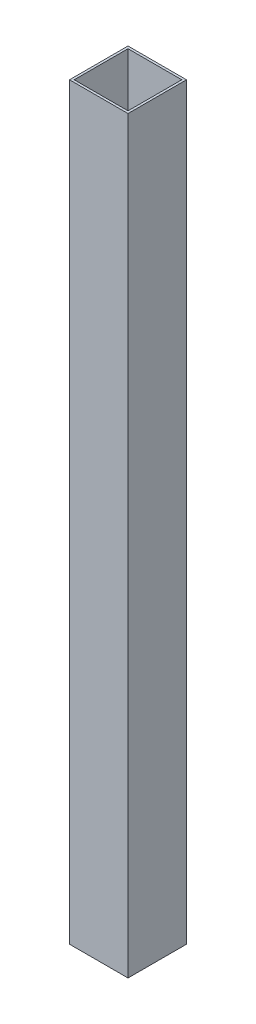
ISO-10303-21;
HEADER;
FILE_DESCRIPTION(('STEP AP214'),'2;1');
FILE_NAME('part.step','',(''),(''),'','','');
FILE_SCHEMA(('AUTOMOTIVE_DESIGN { 1 0 10303 214 1 1 1 1 }'));
ENDSEC;
DATA;
#1=APPLICATION_CONTEXT('core data for automotive mechanical design processes');
#2=APPLICATION_PROTOCOL_DEFINITION('international standard','automotive_design',2000,#1);
#3=PRODUCT_CONTEXT('',#1,'mechanical');
#4=PRODUCT('Part','Part','',(#3));
#5=PRODUCT_RELATED_PRODUCT_CATEGORY('part','',(#4));
#6=PRODUCT_DEFINITION_FORMATION('','',#4);
#7=PRODUCT_DEFINITION_CONTEXT('part definition',#1,'design');
#8=PRODUCT_DEFINITION('design','',#6,#7);
#9=PRODUCT_DEFINITION_SHAPE('','',#8);
#10=(LENGTH_UNIT() NAMED_UNIT(*) SI_UNIT(.MILLI.,.METRE.));
#11=(NAMED_UNIT(*) PLANE_ANGLE_UNIT() SI_UNIT($,.RADIAN.));
#12=(NAMED_UNIT(*) SI_UNIT($,.STERADIAN.) SOLID_ANGLE_UNIT());
#13=UNCERTAINTY_MEASURE_WITH_UNIT(LENGTH_MEASURE(1.E-05),#10,'distance_accuracy_value','');
#14=(GEOMETRIC_REPRESENTATION_CONTEXT(3) GLOBAL_UNCERTAINTY_ASSIGNED_CONTEXT((#13)) GLOBAL_UNIT_ASSIGNED_CONTEXT((#10,
#11,#12)) REPRESENTATION_CONTEXT('',''));
#15=CARTESIAN_POINT('',(0.,0.,0.));
#16=DIRECTION('',(0.,0.,1.));
#17=DIRECTION('',(1.,0.,0.));
#18=AXIS2_PLACEMENT_3D('',#15,#16,#17);
#19=CARTESIAN_POINT('',(0.,640.,0.));
#20=DIRECTION('',(0.,-1.,0.));
#21=DIRECTION('',(0.,0.,-1.));
#22=AXIS2_PLACEMENT_3D('',#19,#20,#21);
#23=PLANE('',#22);
#24=DIRECTION('',(0.,0.,-1.));
#25=VECTOR('',#24,1.);
#26=CARTESIAN_POINT('',(25.,640.,25.));
#27=LINE('',#26,#25);
#28=CARTESIAN_POINT('',(25.,640.,25.));
#29=VERTEX_POINT('',#28);
#30=CARTESIAN_POINT('',(25.,640.,-25.));
#31=VERTEX_POINT('',#30);
#32=EDGE_CURVE('E153',#29,#31,#27,.T.);
#33=ORIENTED_EDGE('',*,*,#32,.T.);
#34=DIRECTION('',(-1.,0.,0.));
#35=VECTOR('',#34,1.);
#36=CARTESIAN_POINT('',(-25.,640.,-25.));
#37=LINE('',#36,#35);
#38=CARTESIAN_POINT('',(-25.,640.,-25.));
#39=VERTEX_POINT('',#38);
#40=EDGE_CURVE('E157',#31,#39,#37,.T.);
#41=ORIENTED_EDGE('',*,*,#40,.T.);
#42=DIRECTION('',(0.,0.,1.));
#43=VECTOR('',#42,1.);
#44=CARTESIAN_POINT('',(-25.,640.,25.));
#45=LINE('',#44,#43);
#46=CARTESIAN_POINT('',(-25.,640.,25.));
#47=VERTEX_POINT('',#46);
#48=EDGE_CURVE('E161',#39,#47,#45,.T.);
#49=ORIENTED_EDGE('',*,*,#48,.T.);
#50=DIRECTION('',(1.,0.,0.));
#51=VECTOR('',#50,1.);
#52=CARTESIAN_POINT('',(-25.,640.,25.));
#53=LINE('',#52,#51);
#54=EDGE_CURVE('E164',#47,#29,#53,.T.);
#55=ORIENTED_EDGE('',*,*,#54,.T.);
#56=EDGE_LOOP('',(#33,#41,#49,#55));
#57=FACE_BOUND('',#56,.T.);
#58=DIRECTION('',(0.,0.,1.));
#59=VECTOR('',#58,1.);
#60=CARTESIAN_POINT('',(-23.,640.,23.));
#61=LINE('',#60,#59);
#62=CARTESIAN_POINT('',(-23.,640.,-23.));
#63=VERTEX_POINT('',#62);
#64=CARTESIAN_POINT('',(-23.,640.,23.));
#65=VERTEX_POINT('',#64);
#66=EDGE_CURVE('E105',#63,#65,#61,.T.);
#67=ORIENTED_EDGE('',*,*,#66,.F.);
#68=DIRECTION('',(-1.,0.,0.));
#69=VECTOR('',#68,1.);
#70=CARTESIAN_POINT('',(-23.,640.,-23.));
#71=LINE('',#70,#69);
#72=CARTESIAN_POINT('',(23.,640.,-23.));
#73=VERTEX_POINT('',#72);
#74=EDGE_CURVE('E131',#73,#63,#71,.T.);
#75=ORIENTED_EDGE('',*,*,#74,.F.);
#76=DIRECTION('',(0.,0.,-1.));
#77=VECTOR('',#76,1.);
#78=CARTESIAN_POINT('',(23.,640.,23.));
#79=LINE('',#78,#77);
#80=CARTESIAN_POINT('',(23.,640.,23.));
#81=VERTEX_POINT('',#80);
#82=EDGE_CURVE('E127',#81,#73,#79,.T.);
#83=ORIENTED_EDGE('',*,*,#82,.F.);
#84=DIRECTION('',(1.,0.,0.));
#85=VECTOR('',#84,1.);
#86=CARTESIAN_POINT('',(-23.,640.,23.));
#87=LINE('',#86,#85);
#88=EDGE_CURVE('E114',#65,#81,#87,.T.);
#89=ORIENTED_EDGE('',*,*,#88,.F.);
#90=EDGE_LOOP('',(#67,#75,#83,#89));
#91=FACE_BOUND('',#90,.T.);
#92=ADVANCED_FACE('F39',(#57,#91),#23,.F.);
#93=CARTESIAN_POINT('',(0.,0.,0.));
#94=DIRECTION('',(0.,-1.,0.));
#95=DIRECTION('',(0.,0.,-1.));
#96=AXIS2_PLACEMENT_3D('',#93,#94,#95);
#97=PLANE('',#96);
#98=DIRECTION('',(0.,0.,-1.));
#99=VECTOR('',#98,1.);
#100=CARTESIAN_POINT('',(25.,0.,25.));
#101=LINE('',#100,#99);
#102=CARTESIAN_POINT('',(25.,0.,25.));
#103=VERTEX_POINT('',#102);
#104=CARTESIAN_POINT('',(25.,0.,-25.));
#105=VERTEX_POINT('',#104);
#106=EDGE_CURVE('E123',#103,#105,#101,.T.);
#107=ORIENTED_EDGE('',*,*,#106,.F.);
#108=DIRECTION('',(1.,0.,0.));
#109=VECTOR('',#108,1.);
#110=CARTESIAN_POINT('',(-25.,0.,25.));
#111=LINE('',#110,#109);
#112=CARTESIAN_POINT('',(-25.,0.,25.));
#113=VERTEX_POINT('',#112);
#114=EDGE_CURVE('E158',#113,#103,#111,.T.);
#115=ORIENTED_EDGE('',*,*,#114,.F.);
#116=DIRECTION('',(0.,0.,1.));
#117=VECTOR('',#116,1.);
#118=CARTESIAN_POINT('',(-25.,0.,25.));
#119=LINE('',#118,#117);
#120=CARTESIAN_POINT('',(-25.,0.,-25.));
#121=VERTEX_POINT('',#120);
#122=EDGE_CURVE('E174',#121,#113,#119,.T.);
#123=ORIENTED_EDGE('',*,*,#122,.F.);
#124=DIRECTION('',(-1.,0.,0.));
#125=VECTOR('',#124,1.);
#126=CARTESIAN_POINT('',(-25.,0.,-25.));
#127=LINE('',#126,#125);
#128=EDGE_CURVE('E171',#105,#121,#127,.T.);
#129=ORIENTED_EDGE('',*,*,#128,.F.);
#130=EDGE_LOOP('',(#107,#115,#123,#129));
#131=FACE_BOUND('',#130,.T.);
#132=DIRECTION('',(-1.,0.,0.));
#133=VECTOR('',#132,1.);
#134=CARTESIAN_POINT('',(-23.,0.,-23.));
#135=LINE('',#134,#133);
#136=CARTESIAN_POINT('',(23.,0.,-23.));
#137=VERTEX_POINT('',#136);
#138=CARTESIAN_POINT('',(-23.,0.,-23.));
#139=VERTEX_POINT('',#138);
#140=EDGE_CURVE('E115',#137,#139,#135,.T.);
#141=ORIENTED_EDGE('',*,*,#140,.T.);
#142=DIRECTION('',(0.,0.,1.));
#143=VECTOR('',#142,1.);
#144=CARTESIAN_POINT('',(-23.,0.,23.));
#145=LINE('',#144,#143);
#146=CARTESIAN_POINT('',(-23.,0.,23.));
#147=VERTEX_POINT('',#146);
#148=EDGE_CURVE('E63',#139,#147,#145,.T.);
#149=ORIENTED_EDGE('',*,*,#148,.T.);
#150=DIRECTION('',(1.,0.,0.));
#151=VECTOR('',#150,1.);
#152=CARTESIAN_POINT('',(-23.,0.,23.));
#153=LINE('',#152,#151);
#154=CARTESIAN_POINT('',(23.,0.,23.));
#155=VERTEX_POINT('',#154);
#156=EDGE_CURVE('E121',#147,#155,#153,.T.);
#157=ORIENTED_EDGE('',*,*,#156,.T.);
#158=DIRECTION('',(0.,0.,-1.));
#159=VECTOR('',#158,1.);
#160=CARTESIAN_POINT('',(23.,0.,23.));
#161=LINE('',#160,#159);
#162=EDGE_CURVE('E140',#155,#137,#161,.T.);
#163=ORIENTED_EDGE('',*,*,#162,.T.);
#164=EDGE_LOOP('',(#141,#149,#157,#163));
#165=FACE_BOUND('',#164,.T.);
#166=ADVANCED_FACE('F197',(#131,#165),#97,.T.);
#167=CARTESIAN_POINT('',(25.,640.,25.));
#168=DIRECTION('',(-1.,0.,0.));
#169=DIRECTION('',(0.,0.,1.));
#170=AXIS2_PLACEMENT_3D('',#167,#168,#169);
#171=PLANE('',#170);
#172=ORIENTED_EDGE('',*,*,#106,.T.);
#173=DIRECTION('',(0.,-1.,0.));
#174=VECTOR('',#173,1.);
#175=CARTESIAN_POINT('',(25.,640.,-25.));
#176=LINE('',#175,#174);
#177=EDGE_CURVE('E11',#31,#105,#176,.T.);
#178=ORIENTED_EDGE('',*,*,#177,.F.);
#179=ORIENTED_EDGE('',*,*,#32,.F.);
#180=DIRECTION('',(0.,-1.,0.));
#181=VECTOR('',#180,1.);
#182=CARTESIAN_POINT('',(25.,640.,25.));
#183=LINE('',#182,#181);
#184=EDGE_CURVE('E167',#29,#103,#183,.T.);
#185=ORIENTED_EDGE('',*,*,#184,.T.);
#186=EDGE_LOOP('',(#172,#178,#179,#185));
#187=FACE_BOUND('',#186,.T.);
#188=ADVANCED_FACE('F41',(#187),#171,.F.);
#189=CARTESIAN_POINT('',(-25.,640.,-25.));
#190=DIRECTION('',(0.,0.,1.));
#191=DIRECTION('',(1.,0.,0.));
#192=AXIS2_PLACEMENT_3D('',#189,#190,#191);
#193=PLANE('',#192);
#194=ORIENTED_EDGE('',*,*,#128,.T.);
#195=DIRECTION('',(0.,-1.,0.));
#196=VECTOR('',#195,1.);
#197=CARTESIAN_POINT('',(-25.,640.,-25.));
#198=LINE('',#197,#196);
#199=EDGE_CURVE('E48',#39,#121,#198,.T.);
#200=ORIENTED_EDGE('',*,*,#199,.F.);
#201=ORIENTED_EDGE('',*,*,#40,.F.);
#202=ORIENTED_EDGE('',*,*,#177,.T.);
#203=EDGE_LOOP('',(#194,#200,#201,#202));
#204=FACE_BOUND('',#203,.T.);
#205=ADVANCED_FACE('F207',(#204),#193,.F.);
#206=CARTESIAN_POINT('',(-25.,640.,25.));
#207=DIRECTION('',(1.,0.,0.));
#208=DIRECTION('',(0.,0.,-1.));
#209=AXIS2_PLACEMENT_3D('',#206,#207,#208);
#210=PLANE('',#209);
#211=ORIENTED_EDGE('',*,*,#122,.T.);
#212=DIRECTION('',(0.,-1.,0.));
#213=VECTOR('',#212,1.);
#214=CARTESIAN_POINT('',(-25.,640.,25.));
#215=LINE('',#214,#213);
#216=EDGE_CURVE('E182',#47,#113,#215,.T.);
#217=ORIENTED_EDGE('',*,*,#216,.F.);
#218=ORIENTED_EDGE('',*,*,#48,.F.);
#219=ORIENTED_EDGE('',*,*,#199,.T.);
#220=EDGE_LOOP('',(#211,#217,#218,#219));
#221=FACE_BOUND('',#220,.T.);
#222=ADVANCED_FACE('F191',(#221),#210,.F.);
#223=CARTESIAN_POINT('',(-25.,640.,25.));
#224=DIRECTION('',(0.,0.,-1.));
#225=DIRECTION('',(-1.,0.,0.));
#226=AXIS2_PLACEMENT_3D('',#223,#224,#225);
#227=PLANE('',#226);
#228=ORIENTED_EDGE('',*,*,#114,.T.);
#229=ORIENTED_EDGE('',*,*,#184,.F.);
#230=ORIENTED_EDGE('',*,*,#54,.F.);
#231=ORIENTED_EDGE('',*,*,#216,.T.);
#232=EDGE_LOOP('',(#228,#229,#230,#231));
#233=FACE_BOUND('',#232,.T.);
#234=ADVANCED_FACE('F201',(#233),#227,.F.);
#235=CARTESIAN_POINT('',(-23.,640.,23.));
#236=DIRECTION('',(1.,0.,0.));
#237=DIRECTION('',(0.,0.,-1.));
#238=AXIS2_PLACEMENT_3D('',#235,#236,#237);
#239=PLANE('',#238);
#240=ORIENTED_EDGE('',*,*,#148,.F.);
#241=DIRECTION('',(0.,-1.,0.));
#242=VECTOR('',#241,1.);
#243=CARTESIAN_POINT('',(-23.,640.,-23.));
#244=LINE('',#243,#242);
#245=EDGE_CURVE('E109',#63,#139,#244,.T.);
#246=ORIENTED_EDGE('',*,*,#245,.F.);
#247=ORIENTED_EDGE('',*,*,#66,.T.);
#248=DIRECTION('',(0.,-1.,0.));
#249=VECTOR('',#248,1.);
#250=CARTESIAN_POINT('',(-23.,640.,23.));
#251=LINE('',#250,#249);
#252=EDGE_CURVE('E108',#65,#147,#251,.T.);
#253=ORIENTED_EDGE('',*,*,#252,.T.);
#254=EDGE_LOOP('',(#240,#246,#247,#253));
#255=FACE_BOUND('',#254,.T.);
#256=ADVANCED_FACE('F107',(#255),#239,.T.);
#257=CARTESIAN_POINT('',(-23.,640.,23.));
#258=DIRECTION('',(0.,0.,-1.));
#259=DIRECTION('',(-1.,0.,0.));
#260=AXIS2_PLACEMENT_3D('',#257,#258,#259);
#261=PLANE('',#260);
#262=ORIENTED_EDGE('',*,*,#156,.F.);
#263=ORIENTED_EDGE('',*,*,#252,.F.);
#264=ORIENTED_EDGE('',*,*,#88,.T.);
#265=DIRECTION('',(0.,-1.,0.));
#266=VECTOR('',#265,1.);
#267=CARTESIAN_POINT('',(23.,640.,23.));
#268=LINE('',#267,#266);
#269=EDGE_CURVE('E124',#81,#155,#268,.T.);
#270=ORIENTED_EDGE('',*,*,#269,.T.);
#271=EDGE_LOOP('',(#262,#263,#264,#270));
#272=FACE_BOUND('',#271,.T.);
#273=ADVANCED_FACE('F118',(#272),#261,.T.);
#274=CARTESIAN_POINT('',(23.,640.,23.));
#275=DIRECTION('',(-1.,0.,0.));
#276=DIRECTION('',(0.,0.,1.));
#277=AXIS2_PLACEMENT_3D('',#274,#275,#276);
#278=PLANE('',#277);
#279=ORIENTED_EDGE('',*,*,#162,.F.);
#280=ORIENTED_EDGE('',*,*,#269,.F.);
#281=ORIENTED_EDGE('',*,*,#82,.T.);
#282=DIRECTION('',(0.,-1.,0.));
#283=VECTOR('',#282,1.);
#284=CARTESIAN_POINT('',(23.,640.,-23.));
#285=LINE('',#284,#283);
#286=EDGE_CURVE('E55',#73,#137,#285,.T.);
#287=ORIENTED_EDGE('',*,*,#286,.T.);
#288=EDGE_LOOP('',(#279,#280,#281,#287));
#289=FACE_BOUND('',#288,.T.);
#290=ADVANCED_FACE('F230',(#289),#278,.T.);
#291=CARTESIAN_POINT('',(-23.,640.,-23.));
#292=DIRECTION('',(0.,0.,1.));
#293=DIRECTION('',(1.,0.,0.));
#294=AXIS2_PLACEMENT_3D('',#291,#292,#293);
#295=PLANE('',#294);
#296=ORIENTED_EDGE('',*,*,#140,.F.);
#297=ORIENTED_EDGE('',*,*,#286,.F.);
#298=ORIENTED_EDGE('',*,*,#74,.T.);
#299=ORIENTED_EDGE('',*,*,#245,.T.);
#300=EDGE_LOOP('',(#296,#297,#298,#299));
#301=FACE_BOUND('',#300,.T.);
#302=ADVANCED_FACE('F234',(#301),#295,.T.);
#303=CLOSED_SHELL('',(#92,#166,#188,#205,#222,#234,#256,#273,#290,#302));
#304=MANIFOLD_SOLID_BREP('B2',#303);
#305=ADVANCED_BREP_SHAPE_REPRESENTATION('',(#18,#304),#14);
#306=SHAPE_DEFINITION_REPRESENTATION(#9,#305);
ENDSEC;
END-ISO-10303-21;
